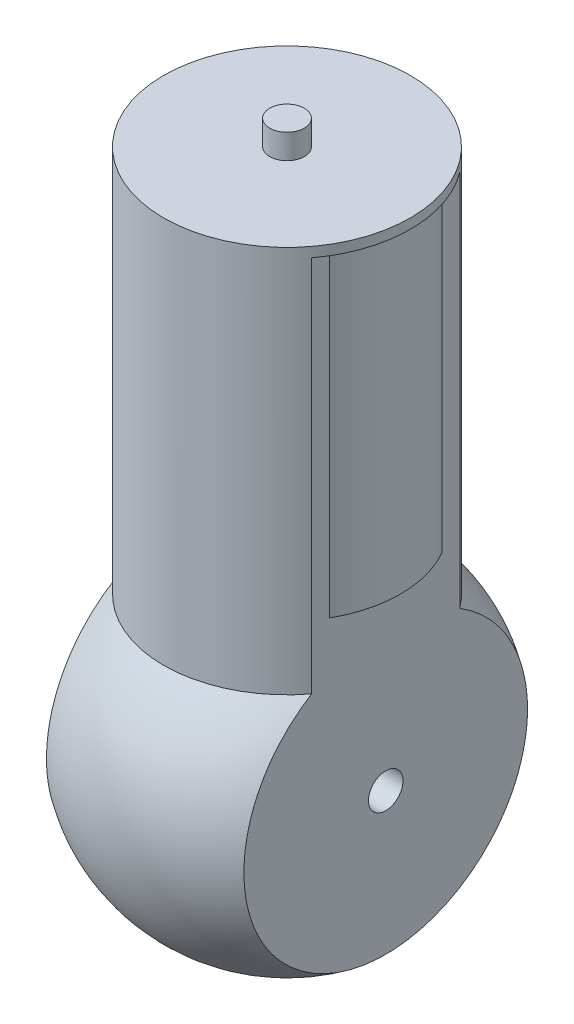
ISO-10303-21;
HEADER;
FILE_DESCRIPTION(('STEP AP214'),'2;1');
FILE_NAME('part.step','',(''),(''),'','','');
FILE_SCHEMA(('AUTOMOTIVE_DESIGN { 1 0 10303 214 1 1 1 1 }'));
ENDSEC;
DATA;
#1=APPLICATION_CONTEXT('core data for automotive mechanical design processes');
#2=APPLICATION_PROTOCOL_DEFINITION('international standard','automotive_design',2000,#1);
#3=PRODUCT_CONTEXT('',#1,'mechanical');
#4=PRODUCT('Part','Part','',(#3));
#5=PRODUCT_RELATED_PRODUCT_CATEGORY('part','',(#4));
#6=PRODUCT_DEFINITION_FORMATION('','',#4);
#7=PRODUCT_DEFINITION_CONTEXT('part definition',#1,'design');
#8=PRODUCT_DEFINITION('design','',#6,#7);
#9=PRODUCT_DEFINITION_SHAPE('','',#8);
#10=(LENGTH_UNIT() NAMED_UNIT(*) SI_UNIT(.MILLI.,.METRE.));
#11=(NAMED_UNIT(*) PLANE_ANGLE_UNIT() SI_UNIT($,.RADIAN.));
#12=(NAMED_UNIT(*) SI_UNIT($,.STERADIAN.) SOLID_ANGLE_UNIT());
#13=UNCERTAINTY_MEASURE_WITH_UNIT(LENGTH_MEASURE(1.E-05),#10,'distance_accuracy_value','');
#14=(GEOMETRIC_REPRESENTATION_CONTEXT(3) GLOBAL_UNCERTAINTY_ASSIGNED_CONTEXT((#13)) GLOBAL_UNIT_ASSIGNED_CONTEXT((#10,
#11,#12)) REPRESENTATION_CONTEXT('',''));
#15=CARTESIAN_POINT('',(0.,0.,0.));
#16=DIRECTION('',(0.,0.,1.));
#17=DIRECTION('',(1.,0.,0.));
#18=AXIS2_PLACEMENT_3D('',#15,#16,#17);
#19=CARTESIAN_POINT('',(0.,103.,0.));
#20=DIRECTION('',(0.,1.,0.));
#21=DIRECTION('',(0.,0.,1.));
#22=AXIS2_PLACEMENT_3D('',#19,#20,#21);
#23=PLANE('',#22);
#24=CARTESIAN_POINT('',(0.,103.,0.));
#25=DIRECTION('',(0.,1.,0.));
#26=DIRECTION('',(0.,0.,1.));
#27=AXIS2_PLACEMENT_3D('',#24,#25,#26);
#28=CIRCLE('',#27,25.);
#29=CARTESIAN_POINT('',(0.,103.,25.));
#30=VERTEX_POINT('',#29);
#31=EDGE_CURVE('E112',#30,#30,#28,.T.);
#32=ORIENTED_EDGE('',*,*,#31,.T.);
#33=EDGE_LOOP('',(#32));
#34=FACE_BOUND('',#33,.T.);
#35=CARTESIAN_POINT('',(0.,103.,0.));
#36=DIRECTION('',(0.,1.,0.));
#37=DIRECTION('',(0.,0.,1.));
#38=AXIS2_PLACEMENT_3D('',#35,#36,#37);
#39=CIRCLE('',#38,3.5);
#40=CARTESIAN_POINT('',(0.,103.,3.5));
#41=VERTEX_POINT('',#40);
#42=EDGE_CURVE('E220',#41,#41,#39,.T.);
#43=ORIENTED_EDGE('',*,*,#42,.F.);
#44=EDGE_LOOP('',(#43));
#45=FACE_BOUND('',#44,.T.);
#46=ADVANCED_FACE('F33',(#34,#45),#23,.T.);
#47=CARTESIAN_POINT('',(0.,0.,0.));
#48=DIRECTION('',(0.,0.,-1.));
#49=DIRECTION('',(1.,0.,0.));
#50=AXIS2_PLACEMENT_3D('',#47,#48,#49);
#51=SPHERICAL_SURFACE('',#50,35.);
#52=CARTESIAN_POINT('',(0.,24.4948974278318,0.));
#53=DIRECTION('',(0.,-1.,0.));
#54=DIRECTION('',(0.,0.,-1.));
#55=AXIS2_PLACEMENT_3D('',#52,#53,#54);
#56=CIRCLE('',#55,25.);
#57=CARTESIAN_POINT('',(-20.,24.4948974278318,15.));
#58=VERTEX_POINT('',#57);
#59=CARTESIAN_POINT('',(20.,24.4948974278318,15.));
#60=VERTEX_POINT('',#59);
#61=EDGE_CURVE('E191',#58,#60,#56,.F.);
#62=ORIENTED_EDGE('',*,*,#61,.F.);
#63=CARTESIAN_POINT('',(-20.,0.,0.));
#64=DIRECTION('',(1.,0.,0.));
#65=DIRECTION('',(0.,0.,-1.));
#66=AXIS2_PLACEMENT_3D('',#63,#64,#65);
#67=CIRCLE('',#66,28.7228132326902);
#68=CARTESIAN_POINT('',(-20.,24.4948974278318,-15.));
#69=VERTEX_POINT('',#68);
#70=EDGE_CURVE('E43',#69,#58,#67,.F.);
#71=ORIENTED_EDGE('',*,*,#70,.F.);
#72=CARTESIAN_POINT('',(0.,24.4948974278318,0.));
#73=DIRECTION('',(0.,-1.,0.));
#74=DIRECTION('',(0.,0.,-1.));
#75=AXIS2_PLACEMENT_3D('',#72,#73,#74);
#76=CIRCLE('',#75,25.);
#77=CARTESIAN_POINT('',(20.,24.4948974278318,-15.));
#78=VERTEX_POINT('',#77);
#79=EDGE_CURVE('E187',#78,#69,#76,.F.);
#80=ORIENTED_EDGE('',*,*,#79,.F.);
#81=CARTESIAN_POINT('',(20.,0.,0.));
#82=DIRECTION('',(-1.,0.,0.));
#83=DIRECTION('',(0.,0.,1.));
#84=AXIS2_PLACEMENT_3D('',#81,#82,#83);
#85=CIRCLE('',#84,28.7228132326902);
#86=EDGE_CURVE('E11',#60,#78,#85,.F.);
#87=ORIENTED_EDGE('',*,*,#86,.F.);
#88=EDGE_LOOP('',(#62,#71,#80,#87));
#89=FACE_BOUND('',#88,.T.);
#90=ADVANCED_FACE('F35',(#89),#51,.T.);
#91=CARTESIAN_POINT('',(20.,35.001,28.7228132326902));
#92=DIRECTION('',(-1.,0.,0.));
#93=DIRECTION('',(0.,0.,1.));
#94=AXIS2_PLACEMENT_3D('',#91,#92,#93);
#95=PLANE('',#94);
#96=CARTESIAN_POINT('',(20.,0.,0.));
#97=DIRECTION('',(-1.,0.,0.));
#98=DIRECTION('',(0.,0.,1.));
#99=AXIS2_PLACEMENT_3D('',#96,#97,#98);
#100=CIRCLE('',#99,3.5);
#101=CARTESIAN_POINT('',(20.,0.,3.5));
#102=VERTEX_POINT('',#101);
#103=EDGE_CURVE('E150',#102,#102,#100,.T.);
#104=ORIENTED_EDGE('',*,*,#103,.T.);
#105=EDGE_LOOP('',(#104));
#106=FACE_BOUND('',#105,.T.);
#107=ORIENTED_EDGE('',*,*,#86,.T.);
#108=DIRECTION('',(0.,-1.,0.));
#109=VECTOR('',#108,1.);
#110=CARTESIAN_POINT('',(20.,36.,-15.));
#111=LINE('',#110,#109);
#112=CARTESIAN_POINT('',(20.,101.,-15.));
#113=VERTEX_POINT('',#112);
#114=EDGE_CURVE('E188',#113,#78,#111,.T.);
#115=ORIENTED_EDGE('',*,*,#114,.F.);
#116=DIRECTION('',(0.,0.,-1.));
#117=VECTOR('',#116,1.);
#118=CARTESIAN_POINT('',(20.,101.,-11.3578166916005));
#119=LINE('',#118,#117);
#120=CARTESIAN_POINT('',(20.,101.,-11.3578166916005));
#121=VERTEX_POINT('',#120);
#122=EDGE_CURVE('E37',#121,#113,#119,.T.);
#123=ORIENTED_EDGE('',*,*,#122,.F.);
#124=DIRECTION('',(0.,-1.,0.));
#125=VECTOR('',#124,1.);
#126=CARTESIAN_POINT('',(20.,86.,-11.3578166916005));
#127=LINE('',#126,#125);
#128=CARTESIAN_POINT('',(20.,36.,-11.3578166916005));
#129=VERTEX_POINT('',#128);
#130=EDGE_CURVE('E107',#121,#129,#127,.T.);
#131=ORIENTED_EDGE('',*,*,#130,.T.);
#132=DIRECTION('',(0.,0.,-1.));
#133=VECTOR('',#132,1.);
#134=CARTESIAN_POINT('',(20.,36.,-15.));
#135=LINE('',#134,#133);
#136=CARTESIAN_POINT('',(20.,36.,11.3578166916005));
#137=VERTEX_POINT('',#136);
#138=EDGE_CURVE('E120',#137,#129,#135,.T.);
#139=ORIENTED_EDGE('',*,*,#138,.F.);
#140=DIRECTION('',(0.,-1.,0.));
#141=VECTOR('',#140,1.);
#142=CARTESIAN_POINT('',(20.,86.,11.3578166916005));
#143=LINE('',#142,#141);
#144=CARTESIAN_POINT('',(20.,101.,11.3578166916005));
#145=VERTEX_POINT('',#144);
#146=EDGE_CURVE('E104',#145,#137,#143,.T.);
#147=ORIENTED_EDGE('',*,*,#146,.F.);
#148=DIRECTION('',(0.,0.,-1.));
#149=VECTOR('',#148,1.);
#150=CARTESIAN_POINT('',(20.,101.,15.));
#151=LINE('',#150,#149);
#152=CARTESIAN_POINT('',(20.,101.,15.));
#153=VERTEX_POINT('',#152);
#154=EDGE_CURVE('E118',#153,#145,#151,.T.);
#155=ORIENTED_EDGE('',*,*,#154,.F.);
#156=DIRECTION('',(0.,-1.,0.));
#157=VECTOR('',#156,1.);
#158=CARTESIAN_POINT('',(20.,36.,15.));
#159=LINE('',#158,#157);
#160=EDGE_CURVE('E186',#153,#60,#159,.T.);
#161=ORIENTED_EDGE('',*,*,#160,.T.);
#162=EDGE_LOOP('',(#107,#115,#123,#131,#139,#147,#155,#161));
#163=FACE_BOUND('',#162,.T.);
#164=ADVANCED_FACE('F116',(#106,#163),#95,.F.);
#165=CARTESIAN_POINT('',(-20.,35.001,28.7228132326902));
#166=DIRECTION('',(1.,0.,0.));
#167=DIRECTION('',(0.,0.,-1.));
#168=AXIS2_PLACEMENT_3D('',#165,#166,#167);
#169=PLANE('',#168);
#170=CARTESIAN_POINT('',(-20.,0.,0.));
#171=DIRECTION('',(-1.,0.,0.));
#172=DIRECTION('',(0.,0.,1.));
#173=AXIS2_PLACEMENT_3D('',#170,#171,#172);
#174=CIRCLE('',#173,3.5);
#175=CARTESIAN_POINT('',(-20.,0.,3.5));
#176=VERTEX_POINT('',#175);
#177=EDGE_CURVE('E153',#176,#176,#174,.T.);
#178=ORIENTED_EDGE('',*,*,#177,.F.);
#179=EDGE_LOOP('',(#178));
#180=FACE_BOUND('',#179,.T.);
#181=ORIENTED_EDGE('',*,*,#70,.T.);
#182=DIRECTION('',(0.,-1.,0.));
#183=VECTOR('',#182,1.);
#184=CARTESIAN_POINT('',(-20.,36.,15.));
#185=LINE('',#184,#183);
#186=CARTESIAN_POINT('',(-20.,101.,15.));
#187=VERTEX_POINT('',#186);
#188=EDGE_CURVE('E140',#187,#58,#185,.T.);
#189=ORIENTED_EDGE('',*,*,#188,.F.);
#190=DIRECTION('',(0.,0.,1.));
#191=VECTOR('',#190,1.);
#192=CARTESIAN_POINT('',(-20.,101.,11.3578166916005));
#193=LINE('',#192,#191);
#194=CARTESIAN_POINT('',(-20.,101.,11.3578166916005));
#195=VERTEX_POINT('',#194);
#196=EDGE_CURVE('E128',#195,#187,#193,.T.);
#197=ORIENTED_EDGE('',*,*,#196,.F.);
#198=DIRECTION('',(0.,-1.,0.));
#199=VECTOR('',#198,1.);
#200=CARTESIAN_POINT('',(-20.,86.,11.3578166916005));
#201=LINE('',#200,#199);
#202=CARTESIAN_POINT('',(-20.,36.,11.3578166916005));
#203=VERTEX_POINT('',#202);
#204=EDGE_CURVE('E121',#195,#203,#201,.T.);
#205=ORIENTED_EDGE('',*,*,#204,.T.);
#206=DIRECTION('',(0.,0.,1.));
#207=VECTOR('',#206,1.);
#208=CARTESIAN_POINT('',(-20.,36.,-15.));
#209=LINE('',#208,#207);
#210=CARTESIAN_POINT('',(-20.,36.,-11.3578166916005));
#211=VERTEX_POINT('',#210);
#212=EDGE_CURVE('E50',#211,#203,#209,.T.);
#213=ORIENTED_EDGE('',*,*,#212,.F.);
#214=DIRECTION('',(0.,-1.,0.));
#215=VECTOR('',#214,1.);
#216=CARTESIAN_POINT('',(-20.,86.,-11.3578166916005));
#217=LINE('',#216,#215);
#218=CARTESIAN_POINT('',(-20.,101.,-11.3578166916005));
#219=VERTEX_POINT('',#218);
#220=EDGE_CURVE('E174',#219,#211,#217,.T.);
#221=ORIENTED_EDGE('',*,*,#220,.F.);
#222=DIRECTION('',(0.,0.,1.));
#223=VECTOR('',#222,1.);
#224=CARTESIAN_POINT('',(-20.,101.,-15.));
#225=LINE('',#224,#223);
#226=CARTESIAN_POINT('',(-20.,101.,-15.));
#227=VERTEX_POINT('',#226);
#228=EDGE_CURVE('E199',#227,#219,#225,.T.);
#229=ORIENTED_EDGE('',*,*,#228,.F.);
#230=DIRECTION('',(0.,-1.,0.));
#231=VECTOR('',#230,1.);
#232=CARTESIAN_POINT('',(-20.,36.,-15.));
#233=LINE('',#232,#231);
#234=EDGE_CURVE('E142',#227,#69,#233,.T.);
#235=ORIENTED_EDGE('',*,*,#234,.T.);
#236=EDGE_LOOP('',(#181,#189,#197,#205,#213,#221,#229,#235));
#237=FACE_BOUND('',#236,.T.);
#238=ADVANCED_FACE('F275',(#180,#237),#169,.F.);
#239=CARTESIAN_POINT('',(0.,36.,0.));
#240=DIRECTION('',(0.,-1.,0.));
#241=DIRECTION('',(0.,0.,-1.));
#242=AXIS2_PLACEMENT_3D('',#239,#240,#241);
#243=CYLINDRICAL_SURFACE('',#242,25.);
#244=ORIENTED_EDGE('',*,*,#188,.T.);
#245=ORIENTED_EDGE('',*,*,#61,.T.);
#246=ORIENTED_EDGE('',*,*,#160,.F.);
#247=CARTESIAN_POINT('',(0.,101.,0.));
#248=DIRECTION('',(0.,1.,0.));
#249=DIRECTION('',(0.,0.,1.));
#250=AXIS2_PLACEMENT_3D('',#247,#248,#249);
#251=CIRCLE('',#250,25.);
#252=EDGE_CURVE('E126',#153,#113,#251,.T.);
#253=ORIENTED_EDGE('',*,*,#252,.T.);
#254=ORIENTED_EDGE('',*,*,#114,.T.);
#255=ORIENTED_EDGE('',*,*,#79,.T.);
#256=ORIENTED_EDGE('',*,*,#234,.F.);
#257=EDGE_CURVE('E208',#227,#187,#251,.T.);
#258=ORIENTED_EDGE('',*,*,#257,.T.);
#259=EDGE_LOOP('',(#244,#245,#246,#253,#254,#255,#256,#258));
#260=FACE_BOUND('',#259,.T.);
#261=ORIENTED_EDGE('',*,*,#31,.F.);
#262=EDGE_LOOP('',(#261));
#263=FACE_BOUND('',#262,.T.);
#264=ADVANCED_FACE('F206',(#260,#263),#243,.T.);
#265=CARTESIAN_POINT('',(-15.,0.,0.));
#266=DIRECTION('',(-1.,0.,0.));
#267=DIRECTION('',(0.,0.,1.));
#268=AXIS2_PLACEMENT_3D('',#265,#266,#267);
#269=CYLINDRICAL_SURFACE('',#268,3.5);
#270=CARTESIAN_POINT('',(-15.,0.,0.));
#271=DIRECTION('',(-1.,0.,0.));
#272=DIRECTION('',(0.,0.,1.));
#273=AXIS2_PLACEMENT_3D('',#270,#271,#272);
#274=CIRCLE('',#273,3.5);
#275=CARTESIAN_POINT('',(-15.,0.,3.5));
#276=VERTEX_POINT('',#275);
#277=EDGE_CURVE('E157',#276,#276,#274,.T.);
#278=ORIENTED_EDGE('',*,*,#277,.F.);
#279=EDGE_LOOP('',(#278));
#280=FACE_BOUND('',#279,.T.);
#281=ORIENTED_EDGE('',*,*,#177,.T.);
#282=EDGE_LOOP('',(#281));
#283=FACE_BOUND('',#282,.T.);
#284=ADVANCED_FACE('F268',(#280,#283),#269,.F.);
#285=CARTESIAN_POINT('',(-15.,0.,0.));
#286=DIRECTION('',(-1.,0.,0.));
#287=DIRECTION('',(0.,0.,1.));
#288=AXIS2_PLACEMENT_3D('',#285,#286,#287);
#289=PLANE('',#288);
#290=ORIENTED_EDGE('',*,*,#277,.T.);
#291=EDGE_LOOP('',(#290));
#292=FACE_BOUND('',#291,.T.);
#293=ADVANCED_FACE('F264',(#292),#289,.T.);
#294=CARTESIAN_POINT('',(20.,0.,0.));
#295=DIRECTION('',(-1.,0.,0.));
#296=DIRECTION('',(0.,0.,1.));
#297=AXIS2_PLACEMENT_3D('',#294,#295,#296);
#298=CYLINDRICAL_SURFACE('',#297,3.5);
#299=ORIENTED_EDGE('',*,*,#103,.F.);
#300=EDGE_LOOP('',(#299));
#301=FACE_BOUND('',#300,.T.);
#302=CARTESIAN_POINT('',(15.,0.,0.));
#303=DIRECTION('',(-1.,0.,0.));
#304=DIRECTION('',(0.,0.,1.));
#305=AXIS2_PLACEMENT_3D('',#302,#303,#304);
#306=CIRCLE('',#305,3.5);
#307=CARTESIAN_POINT('',(15.,0.,3.5));
#308=VERTEX_POINT('',#307);
#309=EDGE_CURVE('E154',#308,#308,#306,.T.);
#310=ORIENTED_EDGE('',*,*,#309,.T.);
#311=EDGE_LOOP('',(#310));
#312=FACE_BOUND('',#311,.T.);
#313=ADVANCED_FACE('F260',(#301,#312),#298,.F.);
#314=CARTESIAN_POINT('',(15.,0.,0.));
#315=DIRECTION('',(-1.,0.,0.));
#316=DIRECTION('',(0.,0.,1.));
#317=AXIS2_PLACEMENT_3D('',#314,#315,#316);
#318=PLANE('',#317);
#319=ORIENTED_EDGE('',*,*,#309,.F.);
#320=EDGE_LOOP('',(#319));
#321=FACE_BOUND('',#320,.T.);
#322=ADVANCED_FACE('F251',(#321),#318,.F.);
#323=CARTESIAN_POINT('',(0.,36.,0.));
#324=DIRECTION('',(0.,1.,0.));
#325=DIRECTION('',(0.,0.,1.));
#326=AXIS2_PLACEMENT_3D('',#323,#324,#325);
#327=PLANE('',#326);
#328=CARTESIAN_POINT('',(0.,36.,0.));
#329=DIRECTION('',(0.,1.,0.));
#330=DIRECTION('',(0.,0.,1.));
#331=AXIS2_PLACEMENT_3D('',#328,#329,#330);
#332=CIRCLE('',#331,23.);
#333=EDGE_CURVE('E127',#137,#129,#332,.T.);
#334=ORIENTED_EDGE('',*,*,#333,.F.);
#335=ORIENTED_EDGE('',*,*,#138,.T.);
#336=EDGE_LOOP('',(#334,#335));
#337=FACE_BOUND('',#336,.T.);
#338=ADVANCED_FACE('F247',(#337),#327,.F.);
#339=CARTESIAN_POINT('',(0.,36.,0.));
#340=DIRECTION('',(0.,1.,0.));
#341=DIRECTION('',(0.,0.,1.));
#342=AXIS2_PLACEMENT_3D('',#339,#340,#341);
#343=CIRCLE('',#342,23.);
#344=EDGE_CURVE('E122',#211,#203,#343,.T.);
#345=ORIENTED_EDGE('',*,*,#344,.F.);
#346=ORIENTED_EDGE('',*,*,#212,.T.);
#347=EDGE_LOOP('',(#345,#346));
#348=FACE_BOUND('',#347,.T.);
#349=ADVANCED_FACE('F250',(#348),#327,.F.);
#350=CARTESIAN_POINT('',(0.,86.,0.));
#351=DIRECTION('',(0.,-1.,0.));
#352=DIRECTION('',(0.,0.,-1.));
#353=AXIS2_PLACEMENT_3D('',#350,#351,#352);
#354=CYLINDRICAL_SURFACE('',#353,23.);
#355=ORIENTED_EDGE('',*,*,#333,.T.);
#356=ORIENTED_EDGE('',*,*,#130,.F.);
#357=CARTESIAN_POINT('',(0.,101.,0.));
#358=DIRECTION('',(0.,1.,0.));
#359=DIRECTION('',(0.,0.,1.));
#360=AXIS2_PLACEMENT_3D('',#357,#358,#359);
#361=CIRCLE('',#360,23.);
#362=EDGE_CURVE('E100',#145,#121,#361,.T.);
#363=ORIENTED_EDGE('',*,*,#362,.F.);
#364=ORIENTED_EDGE('',*,*,#146,.T.);
#365=EDGE_LOOP('',(#355,#356,#363,#364));
#366=FACE_BOUND('',#365,.T.);
#367=ADVANCED_FACE('F103',(#366),#354,.T.);
#368=CARTESIAN_POINT('',(0.,86.,0.));
#369=DIRECTION('',(0.,-1.,0.));
#370=DIRECTION('',(0.,0.,-1.));
#371=AXIS2_PLACEMENT_3D('',#368,#369,#370);
#372=CYLINDRICAL_SURFACE('',#371,23.);
#373=ORIENTED_EDGE('',*,*,#344,.T.);
#374=ORIENTED_EDGE('',*,*,#204,.F.);
#375=CARTESIAN_POINT('',(0.,101.,0.));
#376=DIRECTION('',(0.,1.,0.));
#377=DIRECTION('',(0.,0.,1.));
#378=AXIS2_PLACEMENT_3D('',#375,#376,#377);
#379=CIRCLE('',#378,23.);
#380=EDGE_CURVE('E132',#219,#195,#379,.T.);
#381=ORIENTED_EDGE('',*,*,#380,.F.);
#382=ORIENTED_EDGE('',*,*,#220,.T.);
#383=EDGE_LOOP('',(#373,#374,#381,#382));
#384=FACE_BOUND('',#383,.T.);
#385=ADVANCED_FACE('F246',(#384),#372,.T.);
#386=CARTESIAN_POINT('',(0.,101.,0.));
#387=DIRECTION('',(0.,1.,0.));
#388=DIRECTION('',(0.,0.,1.));
#389=AXIS2_PLACEMENT_3D('',#386,#387,#388);
#390=PLANE('',#389);
#391=ORIENTED_EDGE('',*,*,#257,.F.);
#392=ORIENTED_EDGE('',*,*,#228,.T.);
#393=ORIENTED_EDGE('',*,*,#380,.T.);
#394=ORIENTED_EDGE('',*,*,#196,.T.);
#395=EDGE_LOOP('',(#391,#392,#393,#394));
#396=FACE_BOUND('',#395,.T.);
#397=ADVANCED_FACE('F243',(#396),#390,.F.);
#398=ORIENTED_EDGE('',*,*,#362,.T.);
#399=ORIENTED_EDGE('',*,*,#122,.T.);
#400=ORIENTED_EDGE('',*,*,#252,.F.);
#401=ORIENTED_EDGE('',*,*,#154,.T.);
#402=EDGE_LOOP('',(#398,#399,#400,#401));
#403=FACE_BOUND('',#402,.T.);
#404=ADVANCED_FACE('F124',(#403),#390,.F.);
#405=CARTESIAN_POINT('',(0.,108.,0.));
#406=DIRECTION('',(0.,-1.,0.));
#407=DIRECTION('',(0.,0.,-1.));
#408=AXIS2_PLACEMENT_3D('',#405,#406,#407);
#409=CYLINDRICAL_SURFACE('',#408,3.5);
#410=CARTESIAN_POINT('',(0.,108.,0.));
#411=DIRECTION('',(0.,1.,0.));
#412=DIRECTION('',(0.,0.,1.));
#413=AXIS2_PLACEMENT_3D('',#410,#411,#412);
#414=CIRCLE('',#413,3.5);
#415=CARTESIAN_POINT('',(0.,108.,3.5));
#416=VERTEX_POINT('',#415);
#417=EDGE_CURVE('E213',#416,#416,#414,.T.);
#418=ORIENTED_EDGE('',*,*,#417,.F.);
#419=EDGE_LOOP('',(#418));
#420=FACE_BOUND('',#419,.T.);
#421=ORIENTED_EDGE('',*,*,#42,.T.);
#422=EDGE_LOOP('',(#421));
#423=FACE_BOUND('',#422,.T.);
#424=ADVANCED_FACE('F228',(#420,#423),#409,.T.);
#425=CARTESIAN_POINT('',(0.,108.,0.));
#426=DIRECTION('',(0.,1.,0.));
#427=DIRECTION('',(0.,0.,1.));
#428=AXIS2_PLACEMENT_3D('',#425,#426,#427);
#429=PLANE('',#428);
#430=ORIENTED_EDGE('',*,*,#417,.T.);
#431=EDGE_LOOP('',(#430));
#432=FACE_BOUND('',#431,.T.);
#433=ADVANCED_FACE('F226',(#432),#429,.T.);
#434=CLOSED_SHELL('',(#46,#90,#164,#238,#264,#284,#293,#313,#322,#338,#349,#367,#385,#397,#404,
#424,#433));
#435=MANIFOLD_SOLID_BREP('B2',#434);
#436=ADVANCED_BREP_SHAPE_REPRESENTATION('',(#18,#435),#14);
#437=SHAPE_DEFINITION_REPRESENTATION(#9,#436);
ENDSEC;
END-ISO-10303-21;
